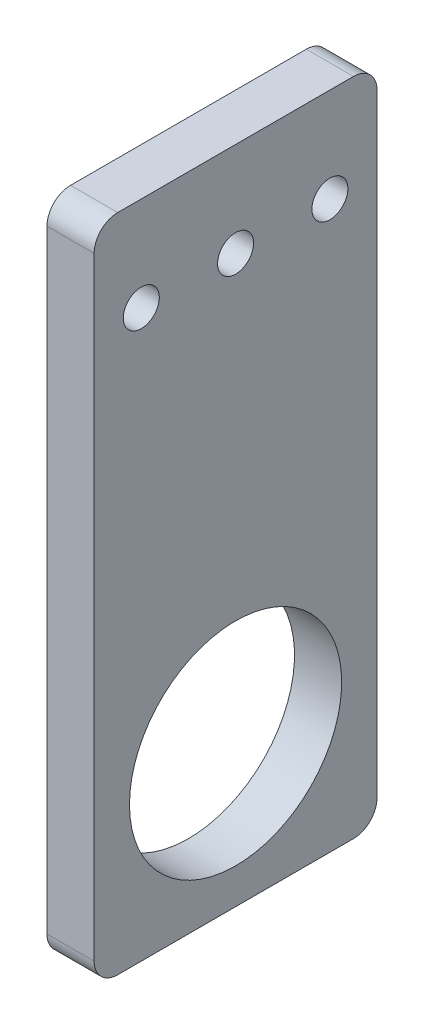
ISO-10303-21;
HEADER;
FILE_DESCRIPTION(('STEP AP214'),'2;1');
FILE_NAME('part.step','',(''),(''),'','','');
FILE_SCHEMA(('AUTOMOTIVE_DESIGN { 1 0 10303 214 1 1 1 1 }'));
ENDSEC;
DATA;
#1=APPLICATION_CONTEXT('core data for automotive mechanical design processes');
#2=APPLICATION_PROTOCOL_DEFINITION('international standard','automotive_design',2000,#1);
#3=PRODUCT_CONTEXT('',#1,'mechanical');
#4=PRODUCT('Part','Part','',(#3));
#5=PRODUCT_RELATED_PRODUCT_CATEGORY('part','',(#4));
#6=PRODUCT_DEFINITION_FORMATION('','',#4);
#7=PRODUCT_DEFINITION_CONTEXT('part definition',#1,'design');
#8=PRODUCT_DEFINITION('design','',#6,#7);
#9=PRODUCT_DEFINITION_SHAPE('','',#8);
#10=(LENGTH_UNIT() NAMED_UNIT(*) SI_UNIT(.MILLI.,.METRE.));
#11=(NAMED_UNIT(*) PLANE_ANGLE_UNIT() SI_UNIT($,.RADIAN.));
#12=(NAMED_UNIT(*) SI_UNIT($,.STERADIAN.) SOLID_ANGLE_UNIT());
#13=UNCERTAINTY_MEASURE_WITH_UNIT(LENGTH_MEASURE(1.E-05),#10,'distance_accuracy_value','');
#14=(GEOMETRIC_REPRESENTATION_CONTEXT(3) GLOBAL_UNCERTAINTY_ASSIGNED_CONTEXT((#13)) GLOBAL_UNIT_ASSIGNED_CONTEXT((#10,
#11,#12)) REPRESENTATION_CONTEXT('',''));
#15=CARTESIAN_POINT('',(0.,0.,0.));
#16=DIRECTION('',(0.,0.,1.));
#17=DIRECTION('',(1.,0.,0.));
#18=AXIS2_PLACEMENT_3D('',#15,#16,#17);
#19=CARTESIAN_POINT('',(-285.75,-44.45,1174.75));
#20=DIRECTION('',(0.,0.,1.));
#21=DIRECTION('',(1.,0.,0.));
#22=AXIS2_PLACEMENT_3D('',#19,#20,#21);
#23=PLANE('',#22);
#24=DIRECTION('',(0.,-1.,0.));
#25=VECTOR('',#24,1.);
#26=CARTESIAN_POINT('',(-285.75,-44.45,1174.75));
#27=LINE('',#26,#25);
#28=CARTESIAN_POINT('',(-285.75,-3.175,1174.75));
#29=VERTEX_POINT('',#28);
#30=CARTESIAN_POINT('',(-285.75,-85.725,1174.75));
#31=VERTEX_POINT('',#30);
#32=EDGE_CURVE('E142',#29,#31,#27,.T.);
#33=ORIENTED_EDGE('',*,*,#32,.T.);
#34=DIRECTION('',(1.,0.,0.));
#35=VECTOR('',#34,1.);
#36=CARTESIAN_POINT('',(-285.75,-85.725,1174.75));
#37=LINE('',#36,#35);
#38=CARTESIAN_POINT('',(-279.4,-85.725,1174.75));
#39=VERTEX_POINT('',#38);
#40=EDGE_CURVE('E138',#31,#39,#37,.T.);
#41=ORIENTED_EDGE('',*,*,#40,.T.);
#42=DIRECTION('',(0.,-1.,0.));
#43=VECTOR('',#42,1.);
#44=CARTESIAN_POINT('',(-279.4,-44.45,1174.75));
#45=LINE('',#44,#43);
#46=CARTESIAN_POINT('',(-279.4,-3.175,1174.75));
#47=VERTEX_POINT('',#46);
#48=EDGE_CURVE('E89',#47,#39,#45,.T.);
#49=ORIENTED_EDGE('',*,*,#48,.F.);
#50=DIRECTION('',(1.,0.,0.));
#51=VECTOR('',#50,1.);
#52=CARTESIAN_POINT('',(-285.75,-3.175,1174.75));
#53=LINE('',#52,#51);
#54=EDGE_CURVE('E136',#47,#29,#53,.F.);
#55=ORIENTED_EDGE('',*,*,#54,.T.);
#56=EDGE_LOOP('',(#33,#41,#49,#55));
#57=FACE_BOUND('',#56,.T.);
#58=ADVANCED_FACE('F17',(#57),#23,.T.);
#59=CARTESIAN_POINT('',(-285.75,0.,622.3));
#60=DIRECTION('',(0.,1.,0.));
#61=DIRECTION('',(0.,0.,1.));
#62=AXIS2_PLACEMENT_3D('',#59,#60,#61);
#63=PLANE('',#62);
#64=DIRECTION('',(0.,0.,1.));
#65=VECTOR('',#64,1.);
#66=CARTESIAN_POINT('',(-285.75,0.,622.3));
#67=LINE('',#66,#65);
#68=CARTESIAN_POINT('',(-285.75,0.,1139.825));
#69=VERTEX_POINT('',#68);
#70=CARTESIAN_POINT('',(-285.75,0.,1171.575));
#71=VERTEX_POINT('',#70);
#72=EDGE_CURVE('E155',#69,#71,#67,.T.);
#73=ORIENTED_EDGE('',*,*,#72,.T.);
#74=DIRECTION('',(1.,0.,0.));
#75=VECTOR('',#74,1.);
#76=CARTESIAN_POINT('',(-285.75,0.,1171.575));
#77=LINE('',#76,#75);
#78=CARTESIAN_POINT('',(-279.4,0.,1171.575));
#79=VERTEX_POINT('',#78);
#80=EDGE_CURVE('E11',#71,#79,#77,.T.);
#81=ORIENTED_EDGE('',*,*,#80,.T.);
#82=DIRECTION('',(0.,0.,1.));
#83=VECTOR('',#82,1.);
#84=CARTESIAN_POINT('',(-279.4,0.,622.3));
#85=LINE('',#84,#83);
#86=CARTESIAN_POINT('',(-279.4,0.,1139.825));
#87=VERTEX_POINT('',#86);
#88=EDGE_CURVE('E167',#87,#79,#85,.T.);
#89=ORIENTED_EDGE('',*,*,#88,.F.);
#90=DIRECTION('',(1.,0.,0.));
#91=VECTOR('',#90,1.);
#92=CARTESIAN_POINT('',(-285.75,0.,1139.825));
#93=LINE('',#92,#91);
#94=EDGE_CURVE('E25',#87,#69,#93,.F.);
#95=ORIENTED_EDGE('',*,*,#94,.T.);
#96=EDGE_LOOP('',(#73,#81,#89,#95));
#97=FACE_BOUND('',#96,.T.);
#98=ADVANCED_FACE('F191',(#97),#63,.T.);
#99=CARTESIAN_POINT('',(-285.75,-44.45,1136.65));
#100=DIRECTION('',(0.,0.,1.));
#101=DIRECTION('',(1.,0.,0.));
#102=AXIS2_PLACEMENT_3D('',#99,#100,#101);
#103=PLANE('',#102);
#104=DIRECTION('',(0.,-1.,0.));
#105=VECTOR('',#104,1.);
#106=CARTESIAN_POINT('',(-279.4,-44.45,1136.65));
#107=LINE('',#106,#105);
#108=CARTESIAN_POINT('',(-279.4,-3.175,1136.65));
#109=VERTEX_POINT('',#108);
#110=CARTESIAN_POINT('',(-279.4,-85.725,1136.65));
#111=VERTEX_POINT('',#110);
#112=EDGE_CURVE('E106',#109,#111,#107,.T.);
#113=ORIENTED_EDGE('',*,*,#112,.T.);
#114=DIRECTION('',(1.,0.,0.));
#115=VECTOR('',#114,1.);
#116=CARTESIAN_POINT('',(-285.75,-85.725,1136.65));
#117=LINE('',#116,#115);
#118=CARTESIAN_POINT('',(-285.75,-85.725,1136.65));
#119=VERTEX_POINT('',#118);
#120=EDGE_CURVE('E128',#111,#119,#117,.F.);
#121=ORIENTED_EDGE('',*,*,#120,.T.);
#122=DIRECTION('',(0.,-1.,0.));
#123=VECTOR('',#122,1.);
#124=CARTESIAN_POINT('',(-285.75,-44.45,1136.65));
#125=LINE('',#124,#123);
#126=CARTESIAN_POINT('',(-285.75,-3.175,1136.65));
#127=VERTEX_POINT('',#126);
#128=EDGE_CURVE('E143',#127,#119,#125,.T.);
#129=ORIENTED_EDGE('',*,*,#128,.F.);
#130=DIRECTION('',(1.,0.,0.));
#131=VECTOR('',#130,1.);
#132=CARTESIAN_POINT('',(-279.4,-3.175,1136.65));
#133=LINE('',#132,#131);
#134=EDGE_CURVE('E125',#127,#109,#133,.T.);
#135=ORIENTED_EDGE('',*,*,#134,.T.);
#136=EDGE_LOOP('',(#113,#121,#129,#135));
#137=FACE_BOUND('',#136,.T.);
#138=ADVANCED_FACE('F180',(#137),#103,.F.);
#139=CARTESIAN_POINT('',(-285.75,-12.7,1155.7));
#140=DIRECTION('',(1.,0.,0.));
#141=DIRECTION('',(0.,0.,-1.));
#142=AXIS2_PLACEMENT_3D('',#139,#140,#141);
#143=CYLINDRICAL_SURFACE('',#142,2.4257);
#144=CARTESIAN_POINT('',(-285.75,-12.7,1155.7));
#145=DIRECTION('',(-1.,0.,0.));
#146=DIRECTION('',(0.,0.,1.));
#147=AXIS2_PLACEMENT_3D('',#144,#145,#146);
#148=CIRCLE('',#147,2.4257);
#149=CARTESIAN_POINT('',(-285.75,-12.7,1158.1257));
#150=VERTEX_POINT('',#149);
#151=EDGE_CURVE('E116',#150,#150,#148,.T.);
#152=ORIENTED_EDGE('',*,*,#151,.T.);
#153=EDGE_LOOP('',(#152));
#154=FACE_BOUND('',#153,.T.);
#155=CARTESIAN_POINT('',(-279.4,-12.7,1155.7));
#156=DIRECTION('',(-1.,0.,0.));
#157=DIRECTION('',(0.,0.,1.));
#158=AXIS2_PLACEMENT_3D('',#155,#156,#157);
#159=CIRCLE('',#158,2.4257);
#160=CARTESIAN_POINT('',(-279.4,-12.7,1158.1257));
#161=VERTEX_POINT('',#160);
#162=EDGE_CURVE('E149',#161,#161,#159,.T.);
#163=ORIENTED_EDGE('',*,*,#162,.F.);
#164=EDGE_LOOP('',(#163));
#165=FACE_BOUND('',#164,.T.);
#166=ADVANCED_FACE('F177',(#154,#165),#143,.F.);
#167=CARTESIAN_POINT('',(-285.75,-12.7,1143.));
#168=DIRECTION('',(1.,0.,0.));
#169=DIRECTION('',(0.,0.,-1.));
#170=AXIS2_PLACEMENT_3D('',#167,#168,#169);
#171=CYLINDRICAL_SURFACE('',#170,2.4257);
#172=CARTESIAN_POINT('',(-285.75,-12.7,1143.));
#173=DIRECTION('',(-1.,0.,0.));
#174=DIRECTION('',(0.,0.,1.));
#175=AXIS2_PLACEMENT_3D('',#172,#173,#174);
#176=CIRCLE('',#175,2.4257);
#177=CARTESIAN_POINT('',(-285.75,-12.7,1145.4257));
#178=VERTEX_POINT('',#177);
#179=EDGE_CURVE('E157',#178,#178,#176,.T.);
#180=ORIENTED_EDGE('',*,*,#179,.T.);
#181=EDGE_LOOP('',(#180));
#182=FACE_BOUND('',#181,.T.);
#183=CARTESIAN_POINT('',(-279.4,-12.7,1143.));
#184=DIRECTION('',(-1.,0.,0.));
#185=DIRECTION('',(0.,0.,1.));
#186=AXIS2_PLACEMENT_3D('',#183,#184,#185);
#187=CIRCLE('',#186,2.4257);
#188=CARTESIAN_POINT('',(-279.4,-12.7,1145.4257));
#189=VERTEX_POINT('',#188);
#190=EDGE_CURVE('E170',#189,#189,#187,.T.);
#191=ORIENTED_EDGE('',*,*,#190,.F.);
#192=EDGE_LOOP('',(#191));
#193=FACE_BOUND('',#192,.T.);
#194=ADVANCED_FACE('F179',(#182,#193),#171,.F.);
#195=CARTESIAN_POINT('',(-285.75,-69.85,1155.7));
#196=DIRECTION('',(1.,0.,0.));
#197=DIRECTION('',(0.,0.,-1.));
#198=AXIS2_PLACEMENT_3D('',#195,#196,#197);
#199=CYLINDRICAL_SURFACE('',#198,14.2875);
#200=CARTESIAN_POINT('',(-285.75,-69.85,1155.7));
#201=DIRECTION('',(-1.,0.,0.));
#202=DIRECTION('',(0.,0.,1.));
#203=AXIS2_PLACEMENT_3D('',#200,#201,#202);
#204=CIRCLE('',#203,14.2875);
#205=CARTESIAN_POINT('',(-285.75,-69.85,1169.9875));
#206=VERTEX_POINT('',#205);
#207=EDGE_CURVE('E152',#206,#206,#204,.T.);
#208=ORIENTED_EDGE('',*,*,#207,.T.);
#209=EDGE_LOOP('',(#208));
#210=FACE_BOUND('',#209,.T.);
#211=CARTESIAN_POINT('',(-279.4,-69.85,1155.7));
#212=DIRECTION('',(-1.,0.,0.));
#213=DIRECTION('',(0.,0.,1.));
#214=AXIS2_PLACEMENT_3D('',#211,#212,#213);
#215=CIRCLE('',#214,14.2875);
#216=CARTESIAN_POINT('',(-279.4,-69.85,1169.9875));
#217=VERTEX_POINT('',#216);
#218=EDGE_CURVE('E105',#217,#217,#215,.T.);
#219=ORIENTED_EDGE('',*,*,#218,.F.);
#220=EDGE_LOOP('',(#219));
#221=FACE_BOUND('',#220,.T.);
#222=ADVANCED_FACE('F188',(#210,#221),#199,.F.);
#223=CARTESIAN_POINT('',(-285.75,-88.9,1155.7));
#224=DIRECTION('',(0.,-1.,0.));
#225=DIRECTION('',(0.,0.,-1.));
#226=AXIS2_PLACEMENT_3D('',#223,#224,#225);
#227=PLANE('',#226);
#228=DIRECTION('',(0.,0.,-1.));
#229=VECTOR('',#228,1.);
#230=CARTESIAN_POINT('',(-285.75,-88.9,1155.7));
#231=LINE('',#230,#229);
#232=CARTESIAN_POINT('',(-285.75,-88.9,1171.575));
#233=VERTEX_POINT('',#232);
#234=CARTESIAN_POINT('',(-285.75,-88.9,1139.825));
#235=VERTEX_POINT('',#234);
#236=EDGE_CURVE('E146',#233,#235,#231,.T.);
#237=ORIENTED_EDGE('',*,*,#236,.T.);
#238=DIRECTION('',(1.,0.,0.));
#239=VECTOR('',#238,1.);
#240=CARTESIAN_POINT('',(-279.4,-88.9,1139.825));
#241=LINE('',#240,#239);
#242=CARTESIAN_POINT('',(-279.4,-88.9,1139.825));
#243=VERTEX_POINT('',#242);
#244=EDGE_CURVE('E104',#235,#243,#241,.T.);
#245=ORIENTED_EDGE('',*,*,#244,.T.);
#246=DIRECTION('',(0.,0.,-1.));
#247=VECTOR('',#246,1.);
#248=CARTESIAN_POINT('',(-279.4,-88.9,1155.7));
#249=LINE('',#248,#247);
#250=CARTESIAN_POINT('',(-279.4,-88.9,1171.575));
#251=VERTEX_POINT('',#250);
#252=EDGE_CURVE('E87',#251,#243,#249,.T.);
#253=ORIENTED_EDGE('',*,*,#252,.F.);
#254=DIRECTION('',(1.,0.,0.));
#255=VECTOR('',#254,1.);
#256=CARTESIAN_POINT('',(-285.75,-88.9,1171.575));
#257=LINE('',#256,#255);
#258=EDGE_CURVE('E101',#251,#233,#257,.F.);
#259=ORIENTED_EDGE('',*,*,#258,.T.);
#260=EDGE_LOOP('',(#237,#245,#253,#259));
#261=FACE_BOUND('',#260,.T.);
#262=ADVANCED_FACE('F100',(#261),#227,.T.);
#263=CARTESIAN_POINT('',(-285.75,-12.7,1168.4));
#264=DIRECTION('',(1.,0.,0.));
#265=DIRECTION('',(0.,0.,-1.));
#266=AXIS2_PLACEMENT_3D('',#263,#264,#265);
#267=CYLINDRICAL_SURFACE('',#266,2.4257);
#268=CARTESIAN_POINT('',(-285.75,-12.7,1168.4));
#269=DIRECTION('',(-1.,0.,0.));
#270=DIRECTION('',(0.,0.,1.));
#271=AXIS2_PLACEMENT_3D('',#268,#269,#270);
#272=CIRCLE('',#271,2.4257);
#273=CARTESIAN_POINT('',(-285.75,-12.7,1170.8257));
#274=VERTEX_POINT('',#273);
#275=EDGE_CURVE('E111',#274,#274,#272,.T.);
#276=ORIENTED_EDGE('',*,*,#275,.T.);
#277=EDGE_LOOP('',(#276));
#278=FACE_BOUND('',#277,.T.);
#279=CARTESIAN_POINT('',(-279.4,-12.7,1168.4));
#280=DIRECTION('',(-1.,0.,0.));
#281=DIRECTION('',(0.,0.,1.));
#282=AXIS2_PLACEMENT_3D('',#279,#280,#281);
#283=CIRCLE('',#282,2.4257);
#284=CARTESIAN_POINT('',(-279.4,-12.7,1170.8257));
#285=VERTEX_POINT('',#284);
#286=EDGE_CURVE('E119',#285,#285,#283,.T.);
#287=ORIENTED_EDGE('',*,*,#286,.F.);
#288=EDGE_LOOP('',(#287));
#289=FACE_BOUND('',#288,.T.);
#290=ADVANCED_FACE('F225',(#278,#289),#267,.F.);
#291=CARTESIAN_POINT('',(-285.75,-44.45,622.3));
#292=DIRECTION('',(-1.,0.,0.));
#293=DIRECTION('',(0.,-1.,0.));
#294=AXIS2_PLACEMENT_3D('',#291,#292,#293);
#295=PLANE('',#294);
#296=ORIENTED_EDGE('',*,*,#128,.T.);
#297=CARTESIAN_POINT('',(-285.75,-85.725,1139.825));
#298=DIRECTION('',(-1.,0.,0.));
#299=DIRECTION('',(0.,0.,1.));
#300=AXIS2_PLACEMENT_3D('',#297,#298,#299);
#301=CIRCLE('',#300,3.175);
#302=EDGE_CURVE('E134',#119,#235,#301,.T.);
#303=ORIENTED_EDGE('',*,*,#302,.T.);
#304=ORIENTED_EDGE('',*,*,#236,.F.);
#305=CARTESIAN_POINT('',(-285.75,-85.725,1171.575));
#306=DIRECTION('',(-1.,0.,0.));
#307=DIRECTION('',(0.,0.,1.));
#308=AXIS2_PLACEMENT_3D('',#305,#306,#307);
#309=CIRCLE('',#308,3.175);
#310=EDGE_CURVE('E110',#233,#31,#309,.T.);
#311=ORIENTED_EDGE('',*,*,#310,.T.);
#312=ORIENTED_EDGE('',*,*,#32,.F.);
#313=CARTESIAN_POINT('',(-285.75,-3.175,1171.575));
#314=DIRECTION('',(-1.,0.,0.));
#315=DIRECTION('',(0.,0.,1.));
#316=AXIS2_PLACEMENT_3D('',#313,#314,#315);
#317=CIRCLE('',#316,3.175);
#318=EDGE_CURVE('E32',#29,#71,#317,.T.);
#319=ORIENTED_EDGE('',*,*,#318,.T.);
#320=ORIENTED_EDGE('',*,*,#72,.F.);
#321=CARTESIAN_POINT('',(-285.75,-3.175,1139.825));
#322=DIRECTION('',(-1.,0.,0.));
#323=DIRECTION('',(0.,0.,1.));
#324=AXIS2_PLACEMENT_3D('',#321,#322,#323);
#325=CIRCLE('',#324,3.175);
#326=EDGE_CURVE('E130',#69,#127,#325,.T.);
#327=ORIENTED_EDGE('',*,*,#326,.T.);
#328=EDGE_LOOP('',(#296,#303,#304,#311,#312,#319,#320,#327));
#329=FACE_BOUND('',#328,.T.);
#330=ORIENTED_EDGE('',*,*,#207,.F.);
#331=EDGE_LOOP('',(#330));
#332=FACE_BOUND('',#331,.T.);
#333=ORIENTED_EDGE('',*,*,#179,.F.);
#334=EDGE_LOOP('',(#333));
#335=FACE_BOUND('',#334,.T.);
#336=ORIENTED_EDGE('',*,*,#151,.F.);
#337=EDGE_LOOP('',(#336));
#338=FACE_BOUND('',#337,.T.);
#339=ORIENTED_EDGE('',*,*,#275,.F.);
#340=EDGE_LOOP('',(#339));
#341=FACE_BOUND('',#340,.T.);
#342=ADVANCED_FACE('F222',(#329,#332,#335,#338,#341),#295,.T.);
#343=CARTESIAN_POINT('',(-279.4,-44.45,622.3));
#344=DIRECTION('',(-1.,0.,0.));
#345=DIRECTION('',(0.,-1.,0.));
#346=AXIS2_PLACEMENT_3D('',#343,#344,#345);
#347=PLANE('',#346);
#348=ORIENTED_EDGE('',*,*,#252,.T.);
#349=CARTESIAN_POINT('',(-279.4,-85.725,1139.825));
#350=DIRECTION('',(-1.,0.,0.));
#351=DIRECTION('',(0.,0.,1.));
#352=AXIS2_PLACEMENT_3D('',#349,#350,#351);
#353=CIRCLE('',#352,3.175);
#354=EDGE_CURVE('E94',#243,#111,#353,.F.);
#355=ORIENTED_EDGE('',*,*,#354,.T.);
#356=ORIENTED_EDGE('',*,*,#112,.F.);
#357=CARTESIAN_POINT('',(-279.4,-3.175,1139.825));
#358=DIRECTION('',(-1.,0.,0.));
#359=DIRECTION('',(0.,0.,1.));
#360=AXIS2_PLACEMENT_3D('',#357,#358,#359);
#361=CIRCLE('',#360,3.175);
#362=EDGE_CURVE('E113',#109,#87,#361,.F.);
#363=ORIENTED_EDGE('',*,*,#362,.T.);
#364=ORIENTED_EDGE('',*,*,#88,.T.);
#365=CARTESIAN_POINT('',(-279.4,-3.175,1171.575));
#366=DIRECTION('',(-1.,0.,0.));
#367=DIRECTION('',(0.,0.,1.));
#368=AXIS2_PLACEMENT_3D('',#365,#366,#367);
#369=CIRCLE('',#368,3.175);
#370=EDGE_CURVE('E95',#79,#47,#369,.F.);
#371=ORIENTED_EDGE('',*,*,#370,.T.);
#372=ORIENTED_EDGE('',*,*,#48,.T.);
#373=CARTESIAN_POINT('',(-279.4,-85.725,1171.575));
#374=DIRECTION('',(-1.,0.,0.));
#375=DIRECTION('',(0.,0.,1.));
#376=AXIS2_PLACEMENT_3D('',#373,#374,#375);
#377=CIRCLE('',#376,3.175);
#378=EDGE_CURVE('E83',#39,#251,#377,.F.);
#379=ORIENTED_EDGE('',*,*,#378,.T.);
#380=EDGE_LOOP('',(#348,#355,#356,#363,#364,#371,#372,#379));
#381=FACE_BOUND('',#380,.T.);
#382=ORIENTED_EDGE('',*,*,#218,.T.);
#383=EDGE_LOOP('',(#382));
#384=FACE_BOUND('',#383,.T.);
#385=ORIENTED_EDGE('',*,*,#190,.T.);
#386=EDGE_LOOP('',(#385));
#387=FACE_BOUND('',#386,.T.);
#388=ORIENTED_EDGE('',*,*,#162,.T.);
#389=EDGE_LOOP('',(#388));
#390=FACE_BOUND('',#389,.T.);
#391=ORIENTED_EDGE('',*,*,#286,.T.);
#392=EDGE_LOOP('',(#391));
#393=FACE_BOUND('',#392,.T.);
#394=ADVANCED_FACE('F85',(#381,#384,#387,#390,#393),#347,.F.);
#395=CARTESIAN_POINT('',(-285.75,-85.725,1139.825));
#396=DIRECTION('',(-1.,0.,0.));
#397=DIRECTION('',(0.,0.,1.));
#398=AXIS2_PLACEMENT_3D('',#395,#396,#397);
#399=CYLINDRICAL_SURFACE('',#398,3.175);
#400=ORIENTED_EDGE('',*,*,#302,.F.);
#401=ORIENTED_EDGE('',*,*,#120,.F.);
#402=ORIENTED_EDGE('',*,*,#354,.F.);
#403=ORIENTED_EDGE('',*,*,#244,.F.);
#404=EDGE_LOOP('',(#400,#401,#402,#403));
#405=FACE_BOUND('',#404,.T.);
#406=ADVANCED_FACE('F203',(#405),#399,.T.);
#407=CARTESIAN_POINT('',(-285.75,-85.725,1171.575));
#408=DIRECTION('',(1.,0.,0.));
#409=DIRECTION('',(0.,0.,-1.));
#410=AXIS2_PLACEMENT_3D('',#407,#408,#409);
#411=CYLINDRICAL_SURFACE('',#410,3.175);
#412=ORIENTED_EDGE('',*,*,#310,.F.);
#413=ORIENTED_EDGE('',*,*,#258,.F.);
#414=ORIENTED_EDGE('',*,*,#378,.F.);
#415=ORIENTED_EDGE('',*,*,#40,.F.);
#416=EDGE_LOOP('',(#412,#413,#414,#415));
#417=FACE_BOUND('',#416,.T.);
#418=ADVANCED_FACE('F109',(#417),#411,.T.);
#419=CARTESIAN_POINT('',(-285.75,-3.175,1171.575));
#420=DIRECTION('',(1.,0.,0.));
#421=DIRECTION('',(0.,0.,-1.));
#422=AXIS2_PLACEMENT_3D('',#419,#420,#421);
#423=CYLINDRICAL_SURFACE('',#422,3.175);
#424=ORIENTED_EDGE('',*,*,#318,.F.);
#425=ORIENTED_EDGE('',*,*,#54,.F.);
#426=ORIENTED_EDGE('',*,*,#370,.F.);
#427=ORIENTED_EDGE('',*,*,#80,.F.);
#428=EDGE_LOOP('',(#424,#425,#426,#427));
#429=FACE_BOUND('',#428,.T.);
#430=ADVANCED_FACE('F208',(#429),#423,.T.);
#431=CARTESIAN_POINT('',(-285.75,-3.175,1139.825));
#432=DIRECTION('',(-1.,0.,0.));
#433=DIRECTION('',(0.,0.,1.));
#434=AXIS2_PLACEMENT_3D('',#431,#432,#433);
#435=CYLINDRICAL_SURFACE('',#434,3.175);
#436=ORIENTED_EDGE('',*,*,#326,.F.);
#437=ORIENTED_EDGE('',*,*,#94,.F.);
#438=ORIENTED_EDGE('',*,*,#362,.F.);
#439=ORIENTED_EDGE('',*,*,#134,.F.);
#440=EDGE_LOOP('',(#436,#437,#438,#439));
#441=FACE_BOUND('',#440,.T.);
#442=ADVANCED_FACE('F19',(#441),#435,.T.);
#443=CLOSED_SHELL('',(#58,#98,#138,#166,#194,#222,#262,#290,#342,#394,#406,#418,#430,#442));
#444=MANIFOLD_SOLID_BREP('B1',#443);
#445=ADVANCED_BREP_SHAPE_REPRESENTATION('',(#18,#444),#14);
#446=SHAPE_DEFINITION_REPRESENTATION(#9,#445);
ENDSEC;
END-ISO-10303-21;
